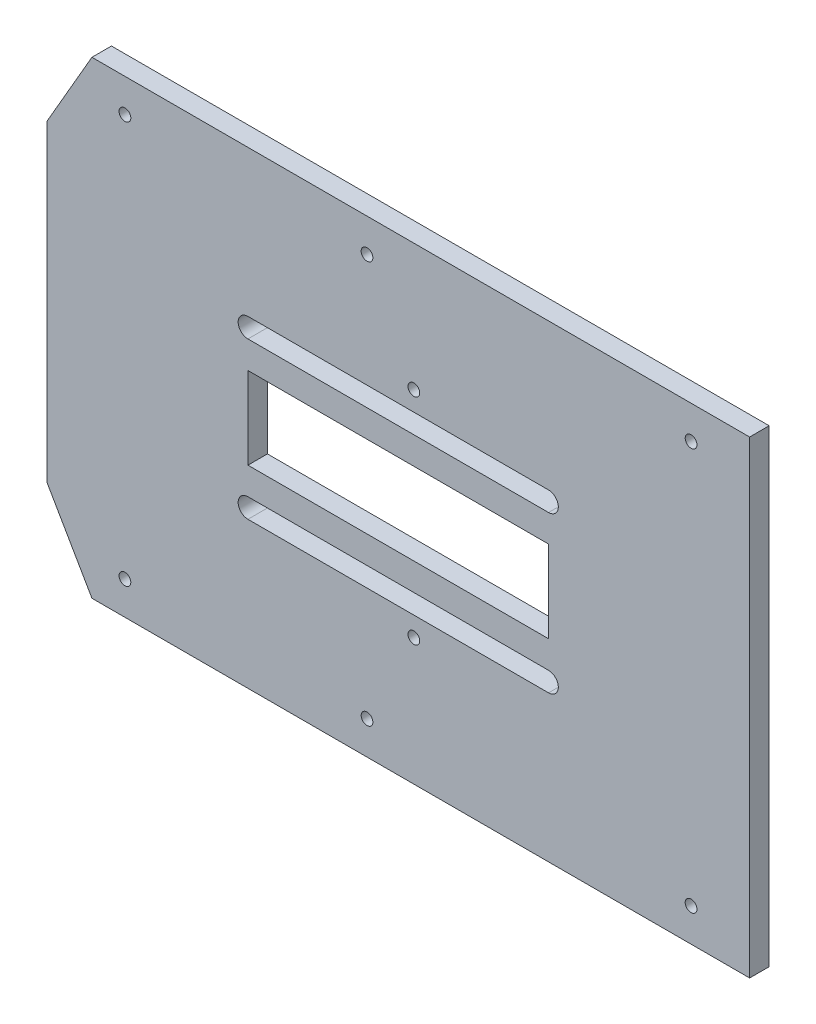
ISO-10303-21;
HEADER;
FILE_DESCRIPTION(('STEP AP214'),'2;1');
FILE_NAME('part.step','',(''),(''),'','','');
FILE_SCHEMA(('AUTOMOTIVE_DESIGN { 1 0 10303 214 1 1 1 1 }'));
ENDSEC;
DATA;
#1=APPLICATION_CONTEXT('core data for automotive mechanical design processes');
#2=APPLICATION_PROTOCOL_DEFINITION('international standard','automotive_design',2000,#1);
#3=PRODUCT_CONTEXT('',#1,'mechanical');
#4=PRODUCT('Part','Part','',(#3));
#5=PRODUCT_RELATED_PRODUCT_CATEGORY('part','',(#4));
#6=PRODUCT_DEFINITION_FORMATION('','',#4);
#7=PRODUCT_DEFINITION_CONTEXT('part definition',#1,'design');
#8=PRODUCT_DEFINITION('design','',#6,#7);
#9=PRODUCT_DEFINITION_SHAPE('','',#8);
#10=(LENGTH_UNIT() NAMED_UNIT(*) SI_UNIT(.MILLI.,.METRE.));
#11=(NAMED_UNIT(*) PLANE_ANGLE_UNIT() SI_UNIT($,.RADIAN.));
#12=(NAMED_UNIT(*) SI_UNIT($,.STERADIAN.) SOLID_ANGLE_UNIT());
#13=UNCERTAINTY_MEASURE_WITH_UNIT(LENGTH_MEASURE(1.E-05),#10,'distance_accuracy_value','');
#14=(GEOMETRIC_REPRESENTATION_CONTEXT(3) GLOBAL_UNCERTAINTY_ASSIGNED_CONTEXT((#13)) GLOBAL_UNIT_ASSIGNED_CONTEXT((#10,
#11,#12)) REPRESENTATION_CONTEXT('',''));
#15=CARTESIAN_POINT('',(0.,0.,0.));
#16=DIRECTION('',(0.,0.,1.));
#17=DIRECTION('',(1.,0.,0.));
#18=AXIS2_PLACEMENT_3D('',#15,#16,#17);
#19=CARTESIAN_POINT('',(0.,0.,5.));
#20=DIRECTION('',(0.,0.,1.));
#21=DIRECTION('',(1.,0.,0.));
#22=AXIS2_PLACEMENT_3D('',#19,#20,#21);
#23=PLANE('',#22);
#24=CARTESIAN_POINT('',(75.,-51.5,5.));
#25=DIRECTION('',(0.,0.,1.));
#26=DIRECTION('',(1.,0.,0.));
#27=AXIS2_PLACEMENT_3D('',#24,#25,#26);
#28=CIRCLE('',#27,1.5);
#29=CARTESIAN_POINT('',(76.5,-51.5,5.));
#30=VERTEX_POINT('',#29);
#31=EDGE_CURVE('E203',#30,#30,#28,.T.);
#32=ORIENTED_EDGE('',*,*,#31,.F.);
#33=EDGE_LOOP('',(#32));
#34=FACE_BOUND('',#33,.T.);
#35=CARTESIAN_POINT('',(-7.99999999999997,-51.5,5.));
#36=DIRECTION('',(0.,0.,1.));
#37=DIRECTION('',(1.,0.,0.));
#38=AXIS2_PLACEMENT_3D('',#35,#36,#37);
#39=CIRCLE('',#38,1.5);
#40=CARTESIAN_POINT('',(-6.49999999999996,-51.5,5.));
#41=VERTEX_POINT('',#40);
#42=EDGE_CURVE('E204',#41,#41,#39,.T.);
#43=ORIENTED_EDGE('',*,*,#42,.F.);
#44=EDGE_LOOP('',(#43));
#45=FACE_BOUND('',#44,.T.);
#46=CARTESIAN_POINT('',(-70.,-51.5,5.));
#47=DIRECTION('',(0.,0.,1.));
#48=DIRECTION('',(1.,0.,0.));
#49=AXIS2_PLACEMENT_3D('',#46,#47,#48);
#50=CIRCLE('',#49,1.5);
#51=CARTESIAN_POINT('',(-68.5,-51.5,5.));
#52=VERTEX_POINT('',#51);
#53=EDGE_CURVE('E211',#52,#52,#50,.T.);
#54=ORIENTED_EDGE('',*,*,#53,.F.);
#55=EDGE_LOOP('',(#54));
#56=FACE_BOUND('',#55,.T.);
#57=CARTESIAN_POINT('',(4.00000000000004,-27.5000000000001,5.));
#58=DIRECTION('',(0.,0.,1.));
#59=DIRECTION('',(1.,0.,0.));
#60=AXIS2_PLACEMENT_3D('',#57,#58,#59);
#61=CIRCLE('',#60,1.5);
#62=CARTESIAN_POINT('',(5.50000000000004,-27.5000000000001,5.));
#63=VERTEX_POINT('',#62);
#64=EDGE_CURVE('E217',#63,#63,#61,.T.);
#65=ORIENTED_EDGE('',*,*,#64,.F.);
#66=EDGE_LOOP('',(#65));
#67=FACE_BOUND('',#66,.T.);
#68=CARTESIAN_POINT('',(75.,51.5,5.));
#69=DIRECTION('',(0.,0.,1.));
#70=DIRECTION('',(1.,0.,0.));
#71=AXIS2_PLACEMENT_3D('',#68,#69,#70);
#72=CIRCLE('',#71,1.5);
#73=CARTESIAN_POINT('',(76.5,51.5,5.));
#74=VERTEX_POINT('',#73);
#75=EDGE_CURVE('E227',#74,#74,#72,.F.);
#76=ORIENTED_EDGE('',*,*,#75,.T.);
#77=EDGE_LOOP('',(#76));
#78=FACE_BOUND('',#77,.T.);
#79=CARTESIAN_POINT('',(-7.99999999999997,51.5,5.));
#80=DIRECTION('',(0.,0.,1.));
#81=DIRECTION('',(1.,0.,0.));
#82=AXIS2_PLACEMENT_3D('',#79,#80,#81);
#83=CIRCLE('',#82,1.5);
#84=CARTESIAN_POINT('',(-6.49999999999996,51.5,5.));
#85=VERTEX_POINT('',#84);
#86=EDGE_CURVE('E228',#85,#85,#83,.F.);
#87=ORIENTED_EDGE('',*,*,#86,.T.);
#88=EDGE_LOOP('',(#87));
#89=FACE_BOUND('',#88,.T.);
#90=CARTESIAN_POINT('',(-70.,51.5,5.));
#91=DIRECTION('',(0.,0.,1.));
#92=DIRECTION('',(1.,0.,0.));
#93=AXIS2_PLACEMENT_3D('',#90,#91,#92);
#94=CIRCLE('',#93,1.5);
#95=CARTESIAN_POINT('',(-68.5,51.5,5.));
#96=VERTEX_POINT('',#95);
#97=EDGE_CURVE('E235',#96,#96,#94,.F.);
#98=ORIENTED_EDGE('',*,*,#97,.T.);
#99=EDGE_LOOP('',(#98));
#100=FACE_BOUND('',#99,.T.);
#101=CARTESIAN_POINT('',(4.00000000000004,27.5000000000001,5.));
#102=DIRECTION('',(0.,0.,1.));
#103=DIRECTION('',(1.,0.,0.));
#104=AXIS2_PLACEMENT_3D('',#101,#102,#103);
#105=CIRCLE('',#104,1.5);
#106=CARTESIAN_POINT('',(5.50000000000004,27.5000000000001,5.));
#107=VERTEX_POINT('',#106);
#108=EDGE_CURVE('E241',#107,#107,#105,.F.);
#109=ORIENTED_EDGE('',*,*,#108,.T.);
#110=EDGE_LOOP('',(#109));
#111=FACE_BOUND('',#110,.T.);
#112=CARTESIAN_POINT('',(-38.5,20.,5.));
#113=DIRECTION('',(0.,0.,1.));
#114=DIRECTION('',(1.,0.,0.));
#115=AXIS2_PLACEMENT_3D('',#112,#113,#114);
#116=CIRCLE('',#115,2.5);
#117=CARTESIAN_POINT('',(-38.5,22.5,5.));
#118=VERTEX_POINT('',#117);
#119=CARTESIAN_POINT('',(-38.5,17.5,5.));
#120=VERTEX_POINT('',#119);
#121=EDGE_CURVE('E255',#118,#120,#116,.T.);
#122=ORIENTED_EDGE('',*,*,#121,.F.);
#123=DIRECTION('',(-1.,0.,0.));
#124=VECTOR('',#123,1.);
#125=CARTESIAN_POINT('',(-38.5,22.5,5.));
#126=LINE('',#125,#124);
#127=CARTESIAN_POINT('',(38.5,22.5,5.));
#128=VERTEX_POINT('',#127);
#129=EDGE_CURVE('E263',#128,#118,#126,.T.);
#130=ORIENTED_EDGE('',*,*,#129,.F.);
#131=CARTESIAN_POINT('',(38.5,20.,5.));
#132=DIRECTION('',(0.,0.,1.));
#133=DIRECTION('',(1.,0.,0.));
#134=AXIS2_PLACEMENT_3D('',#131,#132,#133);
#135=CIRCLE('',#134,2.5);
#136=CARTESIAN_POINT('',(38.5,17.5,5.));
#137=VERTEX_POINT('',#136);
#138=EDGE_CURVE('E260',#137,#128,#135,.T.);
#139=ORIENTED_EDGE('',*,*,#138,.F.);
#140=DIRECTION('',(1.,0.,0.));
#141=VECTOR('',#140,1.);
#142=CARTESIAN_POINT('',(-38.5,17.5,5.));
#143=LINE('',#142,#141);
#144=EDGE_CURVE('E257',#120,#137,#143,.T.);
#145=ORIENTED_EDGE('',*,*,#144,.F.);
#146=EDGE_LOOP('',(#122,#130,#139,#145));
#147=FACE_BOUND('',#146,.T.);
#148=DIRECTION('',(0.,1.,0.));
#149=VECTOR('',#148,1.);
#150=CARTESIAN_POINT('',(38.5,-10.5,5.));
#151=LINE('',#150,#149);
#152=CARTESIAN_POINT('',(38.5,-10.5,5.));
#153=VERTEX_POINT('',#152);
#154=CARTESIAN_POINT('',(38.5,10.5,5.));
#155=VERTEX_POINT('',#154);
#156=EDGE_CURVE('E286',#153,#155,#151,.T.);
#157=ORIENTED_EDGE('',*,*,#156,.F.);
#158=DIRECTION('',(1.,0.,0.));
#159=VECTOR('',#158,1.);
#160=CARTESIAN_POINT('',(-38.5,-10.5,5.));
#161=LINE('',#160,#159);
#162=CARTESIAN_POINT('',(-38.5,-10.5,5.));
#163=VERTEX_POINT('',#162);
#164=EDGE_CURVE('E294',#163,#153,#161,.T.);
#165=ORIENTED_EDGE('',*,*,#164,.F.);
#166=DIRECTION('',(0.,-1.,0.));
#167=VECTOR('',#166,1.);
#168=CARTESIAN_POINT('',(-38.5,-10.5,5.));
#169=LINE('',#168,#167);
#170=CARTESIAN_POINT('',(-38.5,10.5,5.));
#171=VERTEX_POINT('',#170);
#172=EDGE_CURVE('E291',#171,#163,#169,.T.);
#173=ORIENTED_EDGE('',*,*,#172,.F.);
#174=DIRECTION('',(-1.,0.,0.));
#175=VECTOR('',#174,1.);
#176=CARTESIAN_POINT('',(-38.5,10.5,5.));
#177=LINE('',#176,#175);
#178=EDGE_CURVE('E288',#155,#171,#177,.T.);
#179=ORIENTED_EDGE('',*,*,#178,.F.);
#180=EDGE_LOOP('',(#157,#165,#173,#179));
#181=FACE_BOUND('',#180,.T.);
#182=DIRECTION('',(0.,-1.,0.));
#183=VECTOR('',#182,1.);
#184=CARTESIAN_POINT('',(-90.,40.,5.));
#185=LINE('',#184,#183);
#186=CARTESIAN_POINT('',(-90.,40.,5.));
#187=VERTEX_POINT('',#186);
#188=CARTESIAN_POINT('',(-90.,-40.,5.));
#189=VERTEX_POINT('',#188);
#190=EDGE_CURVE('E330',#187,#189,#185,.T.);
#191=ORIENTED_EDGE('',*,*,#190,.T.);
#192=DIRECTION('',(-0.499999999999998,0.86602540378444,0.));
#193=VECTOR('',#192,1.);
#194=CARTESIAN_POINT('',(-78.4529946162076,-60.,5.));
#195=LINE('',#194,#193);
#196=CARTESIAN_POINT('',(-78.4529946162076,-60.,5.));
#197=VERTEX_POINT('',#196);
#198=EDGE_CURVE('E310',#197,#189,#195,.T.);
#199=ORIENTED_EDGE('',*,*,#198,.F.);
#200=DIRECTION('',(-1.,0.,0.));
#201=VECTOR('',#200,1.);
#202=CARTESIAN_POINT('',(90.,-60.,5.));
#203=LINE('',#202,#201);
#204=CARTESIAN_POINT('',(90.,-60.,5.));
#205=VERTEX_POINT('',#204);
#206=EDGE_CURVE('E313',#205,#197,#203,.T.);
#207=ORIENTED_EDGE('',*,*,#206,.F.);
#208=DIRECTION('',(0.,1.,0.));
#209=VECTOR('',#208,1.);
#210=CARTESIAN_POINT('',(90.,0.,5.));
#211=LINE('',#210,#209);
#212=CARTESIAN_POINT('',(90.,60.,5.));
#213=VERTEX_POINT('',#212);
#214=EDGE_CURVE('E332',#205,#213,#211,.T.);
#215=ORIENTED_EDGE('',*,*,#214,.T.);
#216=DIRECTION('',(-1.,0.,0.));
#217=VECTOR('',#216,1.);
#218=CARTESIAN_POINT('',(90.,60.,5.));
#219=LINE('',#218,#217);
#220=CARTESIAN_POINT('',(-78.4529946162076,60.,5.));
#221=VERTEX_POINT('',#220);
#222=EDGE_CURVE('E335',#213,#221,#219,.T.);
#223=ORIENTED_EDGE('',*,*,#222,.T.);
#224=DIRECTION('',(-0.499999999999997,-0.86602540378444,0.));
#225=VECTOR('',#224,1.);
#226=CARTESIAN_POINT('',(-78.4529946162076,60.,5.));
#227=LINE('',#226,#225);
#228=EDGE_CURVE('E337',#221,#187,#227,.T.);
#229=ORIENTED_EDGE('',*,*,#228,.T.);
#230=EDGE_LOOP('',(#191,#199,#207,#215,#223,#229));
#231=FACE_BOUND('',#230,.T.);
#232=DIRECTION('',(-1.,0.,0.));
#233=VECTOR('',#232,1.);
#234=CARTESIAN_POINT('',(-38.5,-22.5,5.));
#235=LINE('',#234,#233);
#236=CARTESIAN_POINT('',(38.5,-22.5,5.));
#237=VERTEX_POINT('',#236);
#238=CARTESIAN_POINT('',(-38.5,-22.5,5.));
#239=VERTEX_POINT('',#238);
#240=EDGE_CURVE('E184',#237,#239,#235,.T.);
#241=ORIENTED_EDGE('',*,*,#240,.T.);
#242=CARTESIAN_POINT('',(-38.5,-20.,5.));
#243=DIRECTION('',(0.,0.,-1.));
#244=DIRECTION('',(1.,0.,0.));
#245=AXIS2_PLACEMENT_3D('',#242,#243,#244);
#246=CIRCLE('',#245,2.5);
#247=CARTESIAN_POINT('',(-38.5,-17.5,5.));
#248=VERTEX_POINT('',#247);
#249=EDGE_CURVE('E56',#239,#248,#246,.T.);
#250=ORIENTED_EDGE('',*,*,#249,.T.);
#251=DIRECTION('',(1.,0.,0.));
#252=VECTOR('',#251,1.);
#253=CARTESIAN_POINT('',(-38.5,-17.5,5.));
#254=LINE('',#253,#252);
#255=CARTESIAN_POINT('',(38.5,-17.5,5.));
#256=VERTEX_POINT('',#255);
#257=EDGE_CURVE('E178',#248,#256,#254,.T.);
#258=ORIENTED_EDGE('',*,*,#257,.T.);
#259=CARTESIAN_POINT('',(38.5,-20.,5.));
#260=DIRECTION('',(0.,0.,-1.));
#261=DIRECTION('',(1.,0.,0.));
#262=AXIS2_PLACEMENT_3D('',#259,#260,#261);
#263=CIRCLE('',#262,2.5);
#264=EDGE_CURVE('E191',#256,#237,#263,.T.);
#265=ORIENTED_EDGE('',*,*,#264,.T.);
#266=EDGE_LOOP('',(#241,#250,#258,#265));
#267=FACE_BOUND('',#266,.T.);
#268=ADVANCED_FACE('F41',(#34,#45,#56,#67,#78,#89,#100,#111,#147,#181,#231,#267),#23,.T.);
#269=CARTESIAN_POINT('',(0.,0.,0.));
#270=DIRECTION('',(0.,0.,1.));
#271=DIRECTION('',(1.,0.,0.));
#272=AXIS2_PLACEMENT_3D('',#269,#270,#271);
#273=PLANE('',#272);
#274=DIRECTION('',(0.,-1.,0.));
#275=VECTOR('',#274,1.);
#276=CARTESIAN_POINT('',(-90.,40.,0.));
#277=LINE('',#276,#275);
#278=CARTESIAN_POINT('',(-90.,40.,0.));
#279=VERTEX_POINT('',#278);
#280=CARTESIAN_POINT('',(-90.,-40.,0.));
#281=VERTEX_POINT('',#280);
#282=EDGE_CURVE('E329',#279,#281,#277,.T.);
#283=ORIENTED_EDGE('',*,*,#282,.F.);
#284=DIRECTION('',(-0.499999999999997,-0.86602540378444,0.));
#285=VECTOR('',#284,1.);
#286=CARTESIAN_POINT('',(-78.4529946162076,60.,0.));
#287=LINE('',#286,#285);
#288=CARTESIAN_POINT('',(-78.4529946162076,60.,0.));
#289=VERTEX_POINT('',#288);
#290=EDGE_CURVE('E333',#289,#279,#287,.T.);
#291=ORIENTED_EDGE('',*,*,#290,.F.);
#292=DIRECTION('',(-1.,0.,0.));
#293=VECTOR('',#292,1.);
#294=CARTESIAN_POINT('',(90.,60.,0.));
#295=LINE('',#294,#293);
#296=CARTESIAN_POINT('',(90.,60.,0.));
#297=VERTEX_POINT('',#296);
#298=EDGE_CURVE('E343',#297,#289,#295,.T.);
#299=ORIENTED_EDGE('',*,*,#298,.F.);
#300=DIRECTION('',(0.,1.,0.));
#301=VECTOR('',#300,1.);
#302=CARTESIAN_POINT('',(90.,0.,0.));
#303=LINE('',#302,#301);
#304=CARTESIAN_POINT('',(90.,-60.,0.));
#305=VERTEX_POINT('',#304);
#306=EDGE_CURVE('E341',#305,#297,#303,.T.);
#307=ORIENTED_EDGE('',*,*,#306,.F.);
#308=DIRECTION('',(-1.,0.,0.));
#309=VECTOR('',#308,1.);
#310=CARTESIAN_POINT('',(90.,-60.,0.));
#311=LINE('',#310,#309);
#312=CARTESIAN_POINT('',(-78.4529946162076,-60.,0.));
#313=VERTEX_POINT('',#312);
#314=EDGE_CURVE('E314',#305,#313,#311,.T.);
#315=ORIENTED_EDGE('',*,*,#314,.T.);
#316=DIRECTION('',(-0.499999999999998,0.86602540378444,0.));
#317=VECTOR('',#316,1.);
#318=CARTESIAN_POINT('',(-78.4529946162076,-60.,0.));
#319=LINE('',#318,#317);
#320=EDGE_CURVE('E309',#313,#281,#319,.T.);
#321=ORIENTED_EDGE('',*,*,#320,.T.);
#322=EDGE_LOOP('',(#283,#291,#299,#307,#315,#321));
#323=FACE_BOUND('',#322,.T.);
#324=DIRECTION('',(-1.,0.,0.));
#325=VECTOR('',#324,1.);
#326=CARTESIAN_POINT('',(-38.5,-10.5,0.));
#327=LINE('',#326,#325);
#328=CARTESIAN_POINT('',(38.5,-10.5,0.));
#329=VERTEX_POINT('',#328);
#330=CARTESIAN_POINT('',(-38.5,-10.5,0.));
#331=VERTEX_POINT('',#330);
#332=EDGE_CURVE('E280',#329,#331,#327,.T.);
#333=ORIENTED_EDGE('',*,*,#332,.F.);
#334=DIRECTION('',(0.,-1.,0.));
#335=VECTOR('',#334,1.);
#336=CARTESIAN_POINT('',(38.5,-10.5,0.));
#337=LINE('',#336,#335);
#338=CARTESIAN_POINT('',(38.5,10.5,0.));
#339=VERTEX_POINT('',#338);
#340=EDGE_CURVE('E283',#339,#329,#337,.T.);
#341=ORIENTED_EDGE('',*,*,#340,.F.);
#342=DIRECTION('',(1.,0.,0.));
#343=VECTOR('',#342,1.);
#344=CARTESIAN_POINT('',(-38.5,10.5,0.));
#345=LINE('',#344,#343);
#346=CARTESIAN_POINT('',(-38.5,10.5,0.));
#347=VERTEX_POINT('',#346);
#348=EDGE_CURVE('E300',#347,#339,#345,.T.);
#349=ORIENTED_EDGE('',*,*,#348,.F.);
#350=DIRECTION('',(0.,1.,0.));
#351=VECTOR('',#350,1.);
#352=CARTESIAN_POINT('',(-38.5,-10.5,0.));
#353=LINE('',#352,#351);
#354=EDGE_CURVE('E278',#331,#347,#353,.T.);
#355=ORIENTED_EDGE('',*,*,#354,.F.);
#356=EDGE_LOOP('',(#333,#341,#349,#355));
#357=FACE_BOUND('',#356,.T.);
#358=DIRECTION('',(1.,0.,0.));
#359=VECTOR('',#358,1.);
#360=CARTESIAN_POINT('',(-38.5,22.5,0.));
#361=LINE('',#360,#359);
#362=CARTESIAN_POINT('',(-38.5,22.5,0.));
#363=VERTEX_POINT('',#362);
#364=CARTESIAN_POINT('',(38.5,22.5,0.));
#365=VERTEX_POINT('',#364);
#366=EDGE_CURVE('E249',#363,#365,#361,.T.);
#367=ORIENTED_EDGE('',*,*,#366,.F.);
#368=CARTESIAN_POINT('',(-38.5,20.,0.));
#369=DIRECTION('',(0.,0.,1.));
#370=DIRECTION('',(1.,0.,0.));
#371=AXIS2_PLACEMENT_3D('',#368,#369,#370);
#372=CIRCLE('',#371,2.5);
#373=CARTESIAN_POINT('',(-38.5,17.5,0.));
#374=VERTEX_POINT('',#373);
#375=EDGE_CURVE('E252',#374,#363,#372,.F.);
#376=ORIENTED_EDGE('',*,*,#375,.F.);
#377=DIRECTION('',(-1.,0.,0.));
#378=VECTOR('',#377,1.);
#379=CARTESIAN_POINT('',(-38.5,17.5,0.));
#380=LINE('',#379,#378);
#381=CARTESIAN_POINT('',(38.5,17.5,0.));
#382=VERTEX_POINT('',#381);
#383=EDGE_CURVE('E269',#382,#374,#380,.T.);
#384=ORIENTED_EDGE('',*,*,#383,.F.);
#385=CARTESIAN_POINT('',(38.5,20.,0.));
#386=DIRECTION('',(0.,0.,1.));
#387=DIRECTION('',(1.,0.,0.));
#388=AXIS2_PLACEMENT_3D('',#385,#386,#387);
#389=CIRCLE('',#388,2.5);
#390=EDGE_CURVE('E231',#365,#382,#389,.F.);
#391=ORIENTED_EDGE('',*,*,#390,.F.);
#392=EDGE_LOOP('',(#367,#376,#384,#391));
#393=FACE_BOUND('',#392,.T.);
#394=CARTESIAN_POINT('',(4.00000000000004,27.5000000000001,0.));
#395=DIRECTION('',(0.,0.,-1.));
#396=DIRECTION('',(-1.,0.,0.));
#397=AXIS2_PLACEMENT_3D('',#394,#395,#396);
#398=CIRCLE('',#397,1.5);
#399=CARTESIAN_POINT('',(2.50000000000004,27.5000000000001,0.));
#400=VERTEX_POINT('',#399);
#401=EDGE_CURVE('E207',#400,#400,#398,.T.);
#402=ORIENTED_EDGE('',*,*,#401,.F.);
#403=EDGE_LOOP('',(#402));
#404=FACE_BOUND('',#403,.T.);
#405=CARTESIAN_POINT('',(-70.,51.5,0.));
#406=DIRECTION('',(0.,0.,-1.));
#407=DIRECTION('',(-1.,0.,0.));
#408=AXIS2_PLACEMENT_3D('',#405,#406,#407);
#409=CIRCLE('',#408,1.5);
#410=CARTESIAN_POINT('',(-71.5,51.5,0.));
#411=VERTEX_POINT('',#410);
#412=EDGE_CURVE('E238',#411,#411,#409,.T.);
#413=ORIENTED_EDGE('',*,*,#412,.F.);
#414=EDGE_LOOP('',(#413));
#415=FACE_BOUND('',#414,.T.);
#416=CARTESIAN_POINT('',(-7.99999999999997,51.5,0.));
#417=DIRECTION('',(0.,0.,-1.));
#418=DIRECTION('',(-1.,0.,0.));
#419=AXIS2_PLACEMENT_3D('',#416,#417,#418);
#420=CIRCLE('',#419,1.5);
#421=CARTESIAN_POINT('',(-9.49999999999997,51.5,0.));
#422=VERTEX_POINT('',#421);
#423=EDGE_CURVE('E232',#422,#422,#420,.T.);
#424=ORIENTED_EDGE('',*,*,#423,.F.);
#425=EDGE_LOOP('',(#424));
#426=FACE_BOUND('',#425,.T.);
#427=CARTESIAN_POINT('',(75.,51.5,0.));
#428=DIRECTION('',(0.,0.,-1.));
#429=DIRECTION('',(-1.,0.,0.));
#430=AXIS2_PLACEMENT_3D('',#427,#428,#429);
#431=CIRCLE('',#430,1.5);
#432=CARTESIAN_POINT('',(73.5,51.5,0.));
#433=VERTEX_POINT('',#432);
#434=EDGE_CURVE('E224',#433,#433,#431,.T.);
#435=ORIENTED_EDGE('',*,*,#434,.F.);
#436=EDGE_LOOP('',(#435));
#437=FACE_BOUND('',#436,.T.);
#438=CARTESIAN_POINT('',(4.00000000000004,-27.5000000000001,0.));
#439=DIRECTION('',(0.,0.,1.));
#440=DIRECTION('',(-1.,0.,0.));
#441=AXIS2_PLACEMENT_3D('',#438,#439,#440);
#442=CIRCLE('',#441,1.5);
#443=CARTESIAN_POINT('',(2.50000000000004,-27.5000000000001,0.));
#444=VERTEX_POINT('',#443);
#445=EDGE_CURVE('E172',#444,#444,#442,.T.);
#446=ORIENTED_EDGE('',*,*,#445,.T.);
#447=EDGE_LOOP('',(#446));
#448=FACE_BOUND('',#447,.T.);
#449=CARTESIAN_POINT('',(-70.,-51.5,0.));
#450=DIRECTION('',(0.,0.,1.));
#451=DIRECTION('',(-1.,0.,0.));
#452=AXIS2_PLACEMENT_3D('',#449,#450,#451);
#453=CIRCLE('',#452,1.5);
#454=CARTESIAN_POINT('',(-71.5,-51.5,0.));
#455=VERTEX_POINT('',#454);
#456=EDGE_CURVE('E214',#455,#455,#453,.T.);
#457=ORIENTED_EDGE('',*,*,#456,.T.);
#458=EDGE_LOOP('',(#457));
#459=FACE_BOUND('',#458,.T.);
#460=CARTESIAN_POINT('',(-7.99999999999997,-51.5,0.));
#461=DIRECTION('',(0.,0.,1.));
#462=DIRECTION('',(-1.,0.,0.));
#463=AXIS2_PLACEMENT_3D('',#460,#461,#462);
#464=CIRCLE('',#463,1.5);
#465=CARTESIAN_POINT('',(-9.49999999999997,-51.5,0.));
#466=VERTEX_POINT('',#465);
#467=EDGE_CURVE('E208',#466,#466,#464,.T.);
#468=ORIENTED_EDGE('',*,*,#467,.T.);
#469=EDGE_LOOP('',(#468));
#470=FACE_BOUND('',#469,.T.);
#471=CARTESIAN_POINT('',(75.,-51.5,0.));
#472=DIRECTION('',(0.,0.,1.));
#473=DIRECTION('',(-1.,0.,0.));
#474=AXIS2_PLACEMENT_3D('',#471,#472,#473);
#475=CIRCLE('',#474,1.5);
#476=CARTESIAN_POINT('',(73.5,-51.5,0.));
#477=VERTEX_POINT('',#476);
#478=EDGE_CURVE('E200',#477,#477,#475,.T.);
#479=ORIENTED_EDGE('',*,*,#478,.T.);
#480=EDGE_LOOP('',(#479));
#481=FACE_BOUND('',#480,.T.);
#482=CARTESIAN_POINT('',(-38.5,-20.,0.));
#483=DIRECTION('',(0.,0.,1.));
#484=DIRECTION('',(1.,0.,0.));
#485=AXIS2_PLACEMENT_3D('',#482,#483,#484);
#486=CIRCLE('',#485,2.5);
#487=CARTESIAN_POINT('',(-38.5,-17.5,0.));
#488=VERTEX_POINT('',#487);
#489=CARTESIAN_POINT('',(-38.5,-22.5,0.));
#490=VERTEX_POINT('',#489);
#491=EDGE_CURVE('E176',#488,#490,#486,.T.);
#492=ORIENTED_EDGE('',*,*,#491,.T.);
#493=DIRECTION('',(1.,0.,0.));
#494=VECTOR('',#493,1.);
#495=CARTESIAN_POINT('',(-38.5,-22.5,0.));
#496=LINE('',#495,#494);
#497=CARTESIAN_POINT('',(38.5,-22.5,0.));
#498=VERTEX_POINT('',#497);
#499=EDGE_CURVE('E165',#490,#498,#496,.T.);
#500=ORIENTED_EDGE('',*,*,#499,.T.);
#501=CARTESIAN_POINT('',(38.5,-20.,0.));
#502=DIRECTION('',(0.,0.,1.));
#503=DIRECTION('',(1.,0.,0.));
#504=AXIS2_PLACEMENT_3D('',#501,#502,#503);
#505=CIRCLE('',#504,2.5);
#506=CARTESIAN_POINT('',(38.5,-17.5,0.));
#507=VERTEX_POINT('',#506);
#508=EDGE_CURVE('E186',#498,#507,#505,.T.);
#509=ORIENTED_EDGE('',*,*,#508,.T.);
#510=DIRECTION('',(-1.,0.,0.));
#511=VECTOR('',#510,1.);
#512=CARTESIAN_POINT('',(-38.5,-17.5,0.));
#513=LINE('',#512,#511);
#514=EDGE_CURVE('E182',#507,#488,#513,.T.);
#515=ORIENTED_EDGE('',*,*,#514,.T.);
#516=EDGE_LOOP('',(#492,#500,#509,#515));
#517=FACE_BOUND('',#516,.T.);
#518=ADVANCED_FACE('F181',(#323,#357,#393,#404,#415,#426,#437,#448,#459,#470,#481,#517),#273,.F.);
#519=CARTESIAN_POINT('',(-90.,40.,5.));
#520=DIRECTION('',(1.,0.,0.));
#521=DIRECTION('',(0.,1.,0.));
#522=AXIS2_PLACEMENT_3D('',#519,#520,#521);
#523=PLANE('',#522);
#524=ORIENTED_EDGE('',*,*,#282,.T.);
#525=DIRECTION('',(0.,0.,-1.));
#526=VECTOR('',#525,1.);
#527=CARTESIAN_POINT('',(-90.,-40.,5.));
#528=LINE('',#527,#526);
#529=EDGE_CURVE('E326',#189,#281,#528,.T.);
#530=ORIENTED_EDGE('',*,*,#529,.F.);
#531=ORIENTED_EDGE('',*,*,#190,.F.);
#532=DIRECTION('',(0.,0.,-1.));
#533=VECTOR('',#532,1.);
#534=CARTESIAN_POINT('',(-90.,40.,5.));
#535=LINE('',#534,#533);
#536=EDGE_CURVE('E339',#187,#279,#535,.T.);
#537=ORIENTED_EDGE('',*,*,#536,.T.);
#538=EDGE_LOOP('',(#524,#530,#531,#537));
#539=FACE_BOUND('',#538,.T.);
#540=ADVANCED_FACE('F43',(#539),#523,.F.);
#541=CARTESIAN_POINT('',(90.,0.,5.));
#542=DIRECTION('',(-1.,0.,0.));
#543=DIRECTION('',(0.,-1.,0.));
#544=AXIS2_PLACEMENT_3D('',#541,#542,#543);
#545=PLANE('',#544);
#546=ORIENTED_EDGE('',*,*,#306,.T.);
#547=DIRECTION('',(0.,0.,-1.));
#548=VECTOR('',#547,1.);
#549=CARTESIAN_POINT('',(90.,60.,5.));
#550=LINE('',#549,#548);
#551=EDGE_CURVE('E11',#213,#297,#550,.T.);
#552=ORIENTED_EDGE('',*,*,#551,.F.);
#553=ORIENTED_EDGE('',*,*,#214,.F.);
#554=DIRECTION('',(0.,0.,-1.));
#555=VECTOR('',#554,1.);
#556=CARTESIAN_POINT('',(90.,-60.,5.));
#557=LINE('',#556,#555);
#558=EDGE_CURVE('E317',#205,#305,#557,.T.);
#559=ORIENTED_EDGE('',*,*,#558,.T.);
#560=EDGE_LOOP('',(#546,#552,#553,#559));
#561=FACE_BOUND('',#560,.T.);
#562=ADVANCED_FACE('F375',(#561),#545,.F.);
#563=CARTESIAN_POINT('',(90.,60.,5.));
#564=DIRECTION('',(0.,-1.,0.));
#565=DIRECTION('',(1.,0.,0.));
#566=AXIS2_PLACEMENT_3D('',#563,#564,#565);
#567=PLANE('',#566);
#568=ORIENTED_EDGE('',*,*,#298,.T.);
#569=DIRECTION('',(0.,0.,-1.));
#570=VECTOR('',#569,1.);
#571=CARTESIAN_POINT('',(-78.4529946162076,60.,5.));
#572=LINE('',#571,#570);
#573=EDGE_CURVE('E49',#221,#289,#572,.T.);
#574=ORIENTED_EDGE('',*,*,#573,.F.);
#575=ORIENTED_EDGE('',*,*,#222,.F.);
#576=ORIENTED_EDGE('',*,*,#551,.T.);
#577=EDGE_LOOP('',(#568,#574,#575,#576));
#578=FACE_BOUND('',#577,.T.);
#579=ADVANCED_FACE('F377',(#578),#567,.F.);
#580=CARTESIAN_POINT('',(-78.4529946162076,60.,5.));
#581=DIRECTION('',(0.86602540378444,-0.499999999999997,0.));
#582=DIRECTION('',(0.499999999999997,0.86602540378444,0.));
#583=AXIS2_PLACEMENT_3D('',#580,#581,#582);
#584=PLANE('',#583);
#585=ORIENTED_EDGE('',*,*,#290,.T.);
#586=ORIENTED_EDGE('',*,*,#536,.F.);
#587=ORIENTED_EDGE('',*,*,#228,.F.);
#588=ORIENTED_EDGE('',*,*,#573,.T.);
#589=EDGE_LOOP('',(#585,#586,#587,#588));
#590=FACE_BOUND('',#589,.T.);
#591=ADVANCED_FACE('F352',(#590),#584,.F.);
#592=CARTESIAN_POINT('',(-78.4529946162076,-60.,5.));
#593=DIRECTION('',(-0.86602540378444,-0.499999999999998,0.));
#594=DIRECTION('',(0.499999999999998,-0.86602540378444,0.));
#595=AXIS2_PLACEMENT_3D('',#592,#593,#594);
#596=PLANE('',#595);
#597=ORIENTED_EDGE('',*,*,#320,.F.);
#598=DIRECTION('',(0.,0.,-1.));
#599=VECTOR('',#598,1.);
#600=CARTESIAN_POINT('',(-78.4529946162076,-60.,5.));
#601=LINE('',#600,#599);
#602=EDGE_CURVE('E324',#197,#313,#601,.T.);
#603=ORIENTED_EDGE('',*,*,#602,.F.);
#604=ORIENTED_EDGE('',*,*,#198,.T.);
#605=ORIENTED_EDGE('',*,*,#529,.T.);
#606=EDGE_LOOP('',(#597,#603,#604,#605));
#607=FACE_BOUND('',#606,.T.);
#608=ADVANCED_FACE('F365',(#607),#596,.T.);
#609=CARTESIAN_POINT('',(90.,-60.,5.));
#610=DIRECTION('',(0.,-1.,0.));
#611=DIRECTION('',(1.,0.,0.));
#612=AXIS2_PLACEMENT_3D('',#609,#610,#611);
#613=PLANE('',#612);
#614=ORIENTED_EDGE('',*,*,#314,.F.);
#615=ORIENTED_EDGE('',*,*,#558,.F.);
#616=ORIENTED_EDGE('',*,*,#206,.T.);
#617=ORIENTED_EDGE('',*,*,#602,.T.);
#618=EDGE_LOOP('',(#614,#615,#616,#617));
#619=FACE_BOUND('',#618,.T.);
#620=ADVANCED_FACE('F373',(#619),#613,.T.);
#621=CARTESIAN_POINT('',(38.5,-10.5,-0.00100000000000013));
#622=DIRECTION('',(1.,0.,0.));
#623=DIRECTION('',(0.,0.,-1.));
#624=AXIS2_PLACEMENT_3D('',#621,#622,#623);
#625=PLANE('',#624);
#626=ORIENTED_EDGE('',*,*,#340,.T.);
#627=DIRECTION('',(0.,0.,1.));
#628=VECTOR('',#627,1.);
#629=CARTESIAN_POINT('',(38.5,-10.5,-0.00100000000000013));
#630=LINE('',#629,#628);
#631=EDGE_CURVE('E298',#329,#153,#630,.T.);
#632=ORIENTED_EDGE('',*,*,#631,.T.);
#633=ORIENTED_EDGE('',*,*,#156,.T.);
#634=DIRECTION('',(0.,0.,1.));
#635=VECTOR('',#634,1.);
#636=CARTESIAN_POINT('',(38.5,10.5,-0.00100000000000013));
#637=LINE('',#636,#635);
#638=EDGE_CURVE('E297',#339,#155,#637,.T.);
#639=ORIENTED_EDGE('',*,*,#638,.F.);
#640=EDGE_LOOP('',(#626,#632,#633,#639));
#641=FACE_BOUND('',#640,.T.);
#642=ADVANCED_FACE('F400',(#641),#625,.F.);
#643=CARTESIAN_POINT('',(-38.5,-10.5,-0.00100000000000013));
#644=DIRECTION('',(0.,-1.,0.));
#645=DIRECTION('',(0.,0.,-1.));
#646=AXIS2_PLACEMENT_3D('',#643,#644,#645);
#647=PLANE('',#646);
#648=ORIENTED_EDGE('',*,*,#332,.T.);
#649=DIRECTION('',(0.,0.,1.));
#650=VECTOR('',#649,1.);
#651=CARTESIAN_POINT('',(-38.5,-10.5,-0.00100000000000013));
#652=LINE('',#651,#650);
#653=EDGE_CURVE('E301',#331,#163,#652,.T.);
#654=ORIENTED_EDGE('',*,*,#653,.T.);
#655=ORIENTED_EDGE('',*,*,#164,.T.);
#656=ORIENTED_EDGE('',*,*,#631,.F.);
#657=EDGE_LOOP('',(#648,#654,#655,#656));
#658=FACE_BOUND('',#657,.T.);
#659=ADVANCED_FACE('F403',(#658),#647,.F.);
#660=CARTESIAN_POINT('',(-38.5,-10.5,-0.00100000000000013));
#661=DIRECTION('',(-1.,0.,0.));
#662=DIRECTION('',(0.,0.,1.));
#663=AXIS2_PLACEMENT_3D('',#660,#661,#662);
#664=PLANE('',#663);
#665=ORIENTED_EDGE('',*,*,#354,.T.);
#666=DIRECTION('',(0.,0.,1.));
#667=VECTOR('',#666,1.);
#668=CARTESIAN_POINT('',(-38.5,10.5,-0.00100000000000013));
#669=LINE('',#668,#667);
#670=EDGE_CURVE('E303',#347,#171,#669,.T.);
#671=ORIENTED_EDGE('',*,*,#670,.T.);
#672=ORIENTED_EDGE('',*,*,#172,.T.);
#673=ORIENTED_EDGE('',*,*,#653,.F.);
#674=EDGE_LOOP('',(#665,#671,#672,#673));
#675=FACE_BOUND('',#674,.T.);
#676=ADVANCED_FACE('F409',(#675),#664,.F.);
#677=CARTESIAN_POINT('',(-38.5,10.5,-0.00100000000000013));
#678=DIRECTION('',(0.,1.,0.));
#679=DIRECTION('',(0.,0.,1.));
#680=AXIS2_PLACEMENT_3D('',#677,#678,#679);
#681=PLANE('',#680);
#682=ORIENTED_EDGE('',*,*,#348,.T.);
#683=ORIENTED_EDGE('',*,*,#638,.T.);
#684=ORIENTED_EDGE('',*,*,#178,.T.);
#685=ORIENTED_EDGE('',*,*,#670,.F.);
#686=EDGE_LOOP('',(#682,#683,#684,#685));
#687=FACE_BOUND('',#686,.T.);
#688=ADVANCED_FACE('F405',(#687),#681,.F.);
#689=CARTESIAN_POINT('',(-38.5,20.,-0.00100000000000013));
#690=DIRECTION('',(0.,0.,1.));
#691=DIRECTION('',(1.,0.,0.));
#692=AXIS2_PLACEMENT_3D('',#689,#690,#691);
#693=CYLINDRICAL_SURFACE('',#692,2.5);
#694=ORIENTED_EDGE('',*,*,#375,.T.);
#695=DIRECTION('',(0.,0.,1.));
#696=VECTOR('',#695,1.);
#697=CARTESIAN_POINT('',(-38.5,22.5,-0.00100000000000013));
#698=LINE('',#697,#696);
#699=EDGE_CURVE('E267',#363,#118,#698,.T.);
#700=ORIENTED_EDGE('',*,*,#699,.T.);
#701=ORIENTED_EDGE('',*,*,#121,.T.);
#702=DIRECTION('',(0.,0.,1.));
#703=VECTOR('',#702,1.);
#704=CARTESIAN_POINT('',(-38.5,17.5,-0.00100000000000013));
#705=LINE('',#704,#703);
#706=EDGE_CURVE('E266',#374,#120,#705,.T.);
#707=ORIENTED_EDGE('',*,*,#706,.F.);
#708=EDGE_LOOP('',(#694,#700,#701,#707));
#709=FACE_BOUND('',#708,.T.);
#710=ADVANCED_FACE('F408',(#709),#693,.F.);
#711=CARTESIAN_POINT('',(-38.5,22.5,-0.00100000000000013));
#712=DIRECTION('',(0.,1.,0.));
#713=DIRECTION('',(0.,0.,1.));
#714=AXIS2_PLACEMENT_3D('',#711,#712,#713);
#715=PLANE('',#714);
#716=ORIENTED_EDGE('',*,*,#366,.T.);
#717=DIRECTION('',(0.,0.,1.));
#718=VECTOR('',#717,1.);
#719=CARTESIAN_POINT('',(38.5,22.5,-0.00100000000000013));
#720=LINE('',#719,#718);
#721=EDGE_CURVE('E270',#365,#128,#720,.T.);
#722=ORIENTED_EDGE('',*,*,#721,.T.);
#723=ORIENTED_EDGE('',*,*,#129,.T.);
#724=ORIENTED_EDGE('',*,*,#699,.F.);
#725=EDGE_LOOP('',(#716,#722,#723,#724));
#726=FACE_BOUND('',#725,.T.);
#727=ADVANCED_FACE('F419',(#726),#715,.F.);
#728=CARTESIAN_POINT('',(38.5,20.,-0.00100000000000013));
#729=DIRECTION('',(0.,0.,1.));
#730=DIRECTION('',(1.,0.,0.));
#731=AXIS2_PLACEMENT_3D('',#728,#729,#730);
#732=CYLINDRICAL_SURFACE('',#731,2.5);
#733=ORIENTED_EDGE('',*,*,#390,.T.);
#734=DIRECTION('',(0.,0.,1.));
#735=VECTOR('',#734,1.);
#736=CARTESIAN_POINT('',(38.5,17.5,-0.00100000000000013));
#737=LINE('',#736,#735);
#738=EDGE_CURVE('E272',#382,#137,#737,.T.);
#739=ORIENTED_EDGE('',*,*,#738,.T.);
#740=ORIENTED_EDGE('',*,*,#138,.T.);
#741=ORIENTED_EDGE('',*,*,#721,.F.);
#742=EDGE_LOOP('',(#733,#739,#740,#741));
#743=FACE_BOUND('',#742,.T.);
#744=ADVANCED_FACE('F425',(#743),#732,.F.);
#745=CARTESIAN_POINT('',(-38.5,17.5,-0.00100000000000013));
#746=DIRECTION('',(0.,-1.,0.));
#747=DIRECTION('',(0.,0.,-1.));
#748=AXIS2_PLACEMENT_3D('',#745,#746,#747);
#749=PLANE('',#748);
#750=ORIENTED_EDGE('',*,*,#383,.T.);
#751=ORIENTED_EDGE('',*,*,#706,.T.);
#752=ORIENTED_EDGE('',*,*,#144,.T.);
#753=ORIENTED_EDGE('',*,*,#738,.F.);
#754=EDGE_LOOP('',(#750,#751,#752,#753));
#755=FACE_BOUND('',#754,.T.);
#756=ADVANCED_FACE('F421',(#755),#749,.F.);
#757=CARTESIAN_POINT('',(4.00000000000004,27.5000000000001,9.24264068711929));
#758=DIRECTION('',(0.,0.,-1.));
#759=DIRECTION('',(-1.,0.,0.));
#760=AXIS2_PLACEMENT_3D('',#757,#758,#759);
#761=CYLINDRICAL_SURFACE('',#760,1.5);
#762=ORIENTED_EDGE('',*,*,#401,.T.);
#763=EDGE_LOOP('',(#762));
#764=FACE_BOUND('',#763,.T.);
#765=ORIENTED_EDGE('',*,*,#108,.F.);
#766=EDGE_LOOP('',(#765));
#767=FACE_BOUND('',#766,.T.);
#768=ADVANCED_FACE('F424',(#764,#767),#761,.F.);
#769=CARTESIAN_POINT('',(-70.,51.5,9.24264068711929));
#770=DIRECTION('',(0.,0.,-1.));
#771=DIRECTION('',(-1.,0.,0.));
#772=AXIS2_PLACEMENT_3D('',#769,#770,#771);
#773=CYLINDRICAL_SURFACE('',#772,1.5);
#774=ORIENTED_EDGE('',*,*,#412,.T.);
#775=EDGE_LOOP('',(#774));
#776=FACE_BOUND('',#775,.T.);
#777=ORIENTED_EDGE('',*,*,#97,.F.);
#778=EDGE_LOOP('',(#777));
#779=FACE_BOUND('',#778,.T.);
#780=ADVANCED_FACE('F435',(#776,#779),#773,.F.);
#781=CARTESIAN_POINT('',(-7.99999999999997,51.5,9.24264068711929));
#782=DIRECTION('',(0.,0.,-1.));
#783=DIRECTION('',(-1.,0.,0.));
#784=AXIS2_PLACEMENT_3D('',#781,#782,#783);
#785=CYLINDRICAL_SURFACE('',#784,1.5);
#786=ORIENTED_EDGE('',*,*,#423,.T.);
#787=EDGE_LOOP('',(#786));
#788=FACE_BOUND('',#787,.T.);
#789=ORIENTED_EDGE('',*,*,#86,.F.);
#790=EDGE_LOOP('',(#789));
#791=FACE_BOUND('',#790,.T.);
#792=ADVANCED_FACE('F439',(#788,#791),#785,.F.);
#793=CARTESIAN_POINT('',(75.,51.5,9.24264068711929));
#794=DIRECTION('',(0.,0.,-1.));
#795=DIRECTION('',(-1.,0.,0.));
#796=AXIS2_PLACEMENT_3D('',#793,#794,#795);
#797=CYLINDRICAL_SURFACE('',#796,1.5);
#798=ORIENTED_EDGE('',*,*,#434,.T.);
#799=EDGE_LOOP('',(#798));
#800=FACE_BOUND('',#799,.T.);
#801=ORIENTED_EDGE('',*,*,#75,.F.);
#802=EDGE_LOOP('',(#801));
#803=FACE_BOUND('',#802,.T.);
#804=ADVANCED_FACE('F443',(#800,#803),#797,.F.);
#805=CARTESIAN_POINT('',(4.00000000000004,-27.5000000000001,9.24264068711929));
#806=DIRECTION('',(0.,0.,-1.));
#807=DIRECTION('',(-1.,0.,0.));
#808=AXIS2_PLACEMENT_3D('',#805,#806,#807);
#809=CYLINDRICAL_SURFACE('',#808,1.5);
#810=ORIENTED_EDGE('',*,*,#445,.F.);
#811=EDGE_LOOP('',(#810));
#812=FACE_BOUND('',#811,.T.);
#813=ORIENTED_EDGE('',*,*,#64,.T.);
#814=EDGE_LOOP('',(#813));
#815=FACE_BOUND('',#814,.T.);
#816=ADVANCED_FACE('F447',(#812,#815),#809,.F.);
#817=CARTESIAN_POINT('',(-70.,-51.5,9.24264068711929));
#818=DIRECTION('',(0.,0.,-1.));
#819=DIRECTION('',(-1.,0.,0.));
#820=AXIS2_PLACEMENT_3D('',#817,#818,#819);
#821=CYLINDRICAL_SURFACE('',#820,1.5);
#822=ORIENTED_EDGE('',*,*,#456,.F.);
#823=EDGE_LOOP('',(#822));
#824=FACE_BOUND('',#823,.T.);
#825=ORIENTED_EDGE('',*,*,#53,.T.);
#826=EDGE_LOOP('',(#825));
#827=FACE_BOUND('',#826,.T.);
#828=ADVANCED_FACE('F451',(#824,#827),#821,.F.);
#829=CARTESIAN_POINT('',(-7.99999999999997,-51.5,9.24264068711929));
#830=DIRECTION('',(0.,0.,-1.));
#831=DIRECTION('',(-1.,0.,0.));
#832=AXIS2_PLACEMENT_3D('',#829,#830,#831);
#833=CYLINDRICAL_SURFACE('',#832,1.5);
#834=ORIENTED_EDGE('',*,*,#467,.F.);
#835=EDGE_LOOP('',(#834));
#836=FACE_BOUND('',#835,.T.);
#837=ORIENTED_EDGE('',*,*,#42,.T.);
#838=EDGE_LOOP('',(#837));
#839=FACE_BOUND('',#838,.T.);
#840=ADVANCED_FACE('F455',(#836,#839),#833,.F.);
#841=CARTESIAN_POINT('',(75.,-51.5,9.24264068711929));
#842=DIRECTION('',(0.,0.,-1.));
#843=DIRECTION('',(-1.,0.,0.));
#844=AXIS2_PLACEMENT_3D('',#841,#842,#843);
#845=CYLINDRICAL_SURFACE('',#844,1.5);
#846=ORIENTED_EDGE('',*,*,#478,.F.);
#847=EDGE_LOOP('',(#846));
#848=FACE_BOUND('',#847,.T.);
#849=ORIENTED_EDGE('',*,*,#31,.T.);
#850=EDGE_LOOP('',(#849));
#851=FACE_BOUND('',#850,.T.);
#852=ADVANCED_FACE('F459',(#848,#851),#845,.F.);
#853=CARTESIAN_POINT('',(-38.5,-20.,-0.00100000000000013));
#854=DIRECTION('',(0.,0.,1.));
#855=DIRECTION('',(1.,0.,0.));
#856=AXIS2_PLACEMENT_3D('',#853,#854,#855);
#857=CYLINDRICAL_SURFACE('',#856,2.5);
#858=DIRECTION('',(0.,0.,1.));
#859=VECTOR('',#858,1.);
#860=CARTESIAN_POINT('',(-38.5,-17.5,-0.00100000000000013));
#861=LINE('',#860,#859);
#862=EDGE_CURVE('E173',#488,#248,#861,.T.);
#863=ORIENTED_EDGE('',*,*,#862,.T.);
#864=ORIENTED_EDGE('',*,*,#249,.F.);
#865=DIRECTION('',(0.,0.,1.));
#866=VECTOR('',#865,1.);
#867=CARTESIAN_POINT('',(-38.5,-22.5,-0.00100000000000013));
#868=LINE('',#867,#866);
#869=EDGE_CURVE('E167',#490,#239,#868,.T.);
#870=ORIENTED_EDGE('',*,*,#869,.F.);
#871=ORIENTED_EDGE('',*,*,#491,.F.);
#872=EDGE_LOOP('',(#863,#864,#870,#871));
#873=FACE_BOUND('',#872,.T.);
#874=ADVANCED_FACE('F175',(#873),#857,.F.);
#875=CARTESIAN_POINT('',(-38.5,-17.5,-0.00100000000000013));
#876=DIRECTION('',(0.,-1.,0.));
#877=DIRECTION('',(0.,0.,-1.));
#878=AXIS2_PLACEMENT_3D('',#875,#876,#877);
#879=PLANE('',#878);
#880=DIRECTION('',(0.,0.,1.));
#881=VECTOR('',#880,1.);
#882=CARTESIAN_POINT('',(38.5,-17.5,-0.00100000000000013));
#883=LINE('',#882,#881);
#884=EDGE_CURVE('E197',#507,#256,#883,.T.);
#885=ORIENTED_EDGE('',*,*,#884,.T.);
#886=ORIENTED_EDGE('',*,*,#257,.F.);
#887=ORIENTED_EDGE('',*,*,#862,.F.);
#888=ORIENTED_EDGE('',*,*,#514,.F.);
#889=EDGE_LOOP('',(#885,#886,#887,#888));
#890=FACE_BOUND('',#889,.T.);
#891=ADVANCED_FACE('F466',(#890),#879,.T.);
#892=CARTESIAN_POINT('',(38.5,-20.,-0.00100000000000013));
#893=DIRECTION('',(0.,0.,1.));
#894=DIRECTION('',(1.,0.,0.));
#895=AXIS2_PLACEMENT_3D('',#892,#893,#894);
#896=CYLINDRICAL_SURFACE('',#895,2.5);
#897=DIRECTION('',(0.,0.,1.));
#898=VECTOR('',#897,1.);
#899=CARTESIAN_POINT('',(38.5,-22.5,-0.00100000000000013));
#900=LINE('',#899,#898);
#901=EDGE_CURVE('E64',#498,#237,#900,.T.);
#902=ORIENTED_EDGE('',*,*,#901,.T.);
#903=ORIENTED_EDGE('',*,*,#264,.F.);
#904=ORIENTED_EDGE('',*,*,#884,.F.);
#905=ORIENTED_EDGE('',*,*,#508,.F.);
#906=EDGE_LOOP('',(#902,#903,#904,#905));
#907=FACE_BOUND('',#906,.T.);
#908=ADVANCED_FACE('F469',(#907),#896,.F.);
#909=CARTESIAN_POINT('',(-38.5,-22.5,-0.00100000000000013));
#910=DIRECTION('',(0.,1.,0.));
#911=DIRECTION('',(0.,0.,1.));
#912=AXIS2_PLACEMENT_3D('',#909,#910,#911);
#913=PLANE('',#912);
#914=ORIENTED_EDGE('',*,*,#869,.T.);
#915=ORIENTED_EDGE('',*,*,#240,.F.);
#916=ORIENTED_EDGE('',*,*,#901,.F.);
#917=ORIENTED_EDGE('',*,*,#499,.F.);
#918=EDGE_LOOP('',(#914,#915,#916,#917));
#919=FACE_BOUND('',#918,.T.);
#920=ADVANCED_FACE('F166',(#919),#913,.T.);
#921=CLOSED_SHELL('',(#268,#518,#540,#562,#579,#591,#608,#620,#642,#659,#676,#688,#710,#727,
#744,#756,#768,#780,#792,#804,#816,#828,#840,#852,#874,#891,#908,#920));
#922=MANIFOLD_SOLID_BREP('B2',#921);
#923=ADVANCED_BREP_SHAPE_REPRESENTATION('',(#18,#922),#14);
#924=SHAPE_DEFINITION_REPRESENTATION(#9,#923);
ENDSEC;
END-ISO-10303-21;
